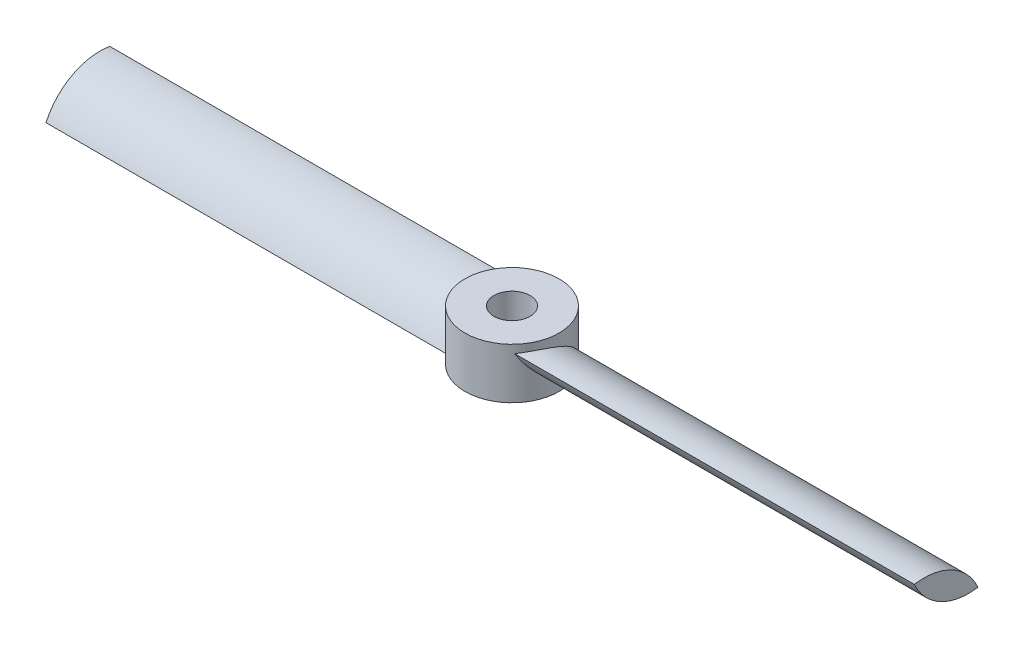
ISO-10303-21;
HEADER;
FILE_DESCRIPTION(('STEP AP214'),'2;1');
FILE_NAME('part.step','',(''),(''),'','','');
FILE_SCHEMA(('AUTOMOTIVE_DESIGN { 1 0 10303 214 1 1 1 1 }'));
ENDSEC;
DATA;
#1=APPLICATION_CONTEXT('core data for automotive mechanical design processes');
#2=APPLICATION_PROTOCOL_DEFINITION('international standard','automotive_design',2000,#1);
#3=PRODUCT_CONTEXT('',#1,'mechanical');
#4=PRODUCT('Part','Part','',(#3));
#5=PRODUCT_RELATED_PRODUCT_CATEGORY('part','',(#4));
#6=PRODUCT_DEFINITION_FORMATION('','',#4);
#7=PRODUCT_DEFINITION_CONTEXT('part definition',#1,'design');
#8=PRODUCT_DEFINITION('design','',#6,#7);
#9=PRODUCT_DEFINITION_SHAPE('','',#8);
#10=(LENGTH_UNIT() NAMED_UNIT(*) SI_UNIT(.MILLI.,.METRE.));
#11=(NAMED_UNIT(*) PLANE_ANGLE_UNIT() SI_UNIT($,.RADIAN.));
#12=(NAMED_UNIT(*) SI_UNIT($,.STERADIAN.) SOLID_ANGLE_UNIT());
#13=UNCERTAINTY_MEASURE_WITH_UNIT(LENGTH_MEASURE(1.E-05),#10,'distance_accuracy_value','');
#14=(GEOMETRIC_REPRESENTATION_CONTEXT(3) GLOBAL_UNCERTAINTY_ASSIGNED_CONTEXT((#13)) GLOBAL_UNIT_ASSIGNED_CONTEXT((#10,
#11,#12)) REPRESENTATION_CONTEXT('',''));
#15=CARTESIAN_POINT('',(0.,0.,0.));
#16=DIRECTION('',(0.,0.,1.));
#17=DIRECTION('',(1.,0.,0.));
#18=AXIS2_PLACEMENT_3D('',#15,#16,#17);
#19=CARTESIAN_POINT('',(0.,7.,0.));
#20=DIRECTION('',(0.,1.,0.));
#21=DIRECTION('',(0.,0.,1.));
#22=AXIS2_PLACEMENT_3D('',#19,#20,#21);
#23=PLANE('',#22);
#24=CARTESIAN_POINT('',(0.,7.,0.));
#25=DIRECTION('',(0.,1.,0.));
#26=DIRECTION('',(0.,0.,1.));
#27=AXIS2_PLACEMENT_3D('',#24,#25,#26);
#28=CIRCLE('',#27,6.5);
#29=CARTESIAN_POINT('',(0.,7.,6.5));
#30=VERTEX_POINT('',#29);
#31=EDGE_CURVE('E139',#30,#30,#28,.T.);
#32=ORIENTED_EDGE('',*,*,#31,.T.);
#33=EDGE_LOOP('',(#32));
#34=FACE_BOUND('',#33,.T.);
#35=CARTESIAN_POINT('',(0.,7.,0.));
#36=DIRECTION('',(0.,1.,0.));
#37=DIRECTION('',(0.,0.,1.));
#38=AXIS2_PLACEMENT_3D('',#35,#36,#37);
#39=CIRCLE('',#38,2.5);
#40=CARTESIAN_POINT('',(0.,7.,2.5));
#41=VERTEX_POINT('',#40);
#42=EDGE_CURVE('E131',#41,#41,#39,.T.);
#43=ORIENTED_EDGE('',*,*,#42,.F.);
#44=EDGE_LOOP('',(#43));
#45=FACE_BOUND('',#44,.T.);
#46=ADVANCED_FACE('F47',(#34,#45),#23,.T.);
#47=CARTESIAN_POINT('',(0.,0.,0.));
#48=DIRECTION('',(0.,1.,0.));
#49=DIRECTION('',(0.,0.,1.));
#50=AXIS2_PLACEMENT_3D('',#47,#48,#49);
#51=PLANE('',#50);
#52=CARTESIAN_POINT('',(0.,0.,0.));
#53=DIRECTION('',(0.,1.,0.));
#54=DIRECTION('',(0.,0.,1.));
#55=AXIS2_PLACEMENT_3D('',#52,#53,#54);
#56=CIRCLE('',#55,6.5);
#57=CARTESIAN_POINT('',(0.,0.,6.5));
#58=VERTEX_POINT('',#57);
#59=EDGE_CURVE('E135',#58,#58,#56,.T.);
#60=ORIENTED_EDGE('',*,*,#59,.F.);
#61=EDGE_LOOP('',(#60));
#62=FACE_BOUND('',#61,.T.);
#63=CARTESIAN_POINT('',(0.,0.,0.));
#64=DIRECTION('',(0.,1.,0.));
#65=DIRECTION('',(0.,0.,1.));
#66=AXIS2_PLACEMENT_3D('',#63,#64,#65);
#67=CIRCLE('',#66,2.5);
#68=CARTESIAN_POINT('',(0.,0.,2.5));
#69=VERTEX_POINT('',#68);
#70=EDGE_CURVE('E130',#69,#69,#67,.T.);
#71=ORIENTED_EDGE('',*,*,#70,.T.);
#72=EDGE_LOOP('',(#71));
#73=FACE_BOUND('',#72,.T.);
#74=ADVANCED_FACE('F175',(#62,#73),#51,.F.);
#75=CARTESIAN_POINT('',(0.,7.,0.));
#76=DIRECTION('',(0.,-1.,0.));
#77=DIRECTION('',(0.,0.,-1.));
#78=AXIS2_PLACEMENT_3D('',#75,#76,#77);
#79=CYLINDRICAL_SURFACE('',#78,6.5);
#80=CARTESIAN_POINT('',(-4.7821821436501,5.87049911517509,-4.40235549961087));
#81=CARTESIAN_POINT('',(-4.83064414254382,5.75307849011286,-4.34971721674044));
#82=CARTESIAN_POINT('',(-4.87990007531833,5.63718924817442,-4.29446194755524));
#83=CARTESIAN_POINT('',(-4.97934252504515,5.40844816549399,-4.1787508646116));
#84=CARTESIAN_POINT('',(-5.02952902312219,5.29559626325717,-4.11829515624686));
#85=CARTESIAN_POINT('',(-5.18064033294913,4.96124427834919,-3.92900023104887));
#86=CARTESIAN_POINT('',(-5.28197964130929,4.74427172089679,-3.79237859337446));
#87=CARTESIAN_POINT('',(-5.48201816255056,4.32081778718442,-3.49709020025005));
#88=CARTESIAN_POINT('',(-5.58068011473167,4.11446532399425,-3.33821366554871));
#89=CARTESIAN_POINT('',(-5.76977191253925,3.71578718343125,-2.99954925464827));
#90=CARTESIAN_POINT('',(-5.8602087829891,3.52344956480868,-2.81977952748504));
#91=CARTESIAN_POINT('',(-6.00082777656387,3.21498198799895,-2.50191697257492));
#92=CARTESIAN_POINT('',(-6.05448191443204,3.09455355994512,-2.36950239094969));
#93=CARTESIAN_POINT('',(-6.15469441903155,2.8614116783889,-2.09547389795706));
#94=CARTESIAN_POINT('',(-6.2012531335545,2.74869784689459,-1.95386043797053));
#95=CARTESIAN_POINT('',(-6.28565115537736,2.53222289336979,-1.66238370282706));
#96=CARTESIAN_POINT('',(-6.32352442507828,2.42842792820188,-1.51255550140705));
#97=CARTESIAN_POINT('',(-6.38931550033209,2.23017901748577,-1.20474113971181));
#98=CARTESIAN_POINT('',(-6.41723496009312,2.13572352171302,-1.04675633996961));
#99=CARTESIAN_POINT('',(-6.45807981110886,1.97148438860737,-0.749617808270409));
#100=CARTESIAN_POINT('',(-6.47269726112326,1.9001786123533,-0.611536570397726));
#101=CARTESIAN_POINT('',(-6.49308830236873,1.76531312347445,-0.331015669890624));
#102=CARTESIAN_POINT('',(-6.49886353682219,1.70175197362269,-0.188576822086766));
#103=CARTESIAN_POINT('',(-6.5008332970216,1.58282493814278,0.0997949089279416));
#104=CARTESIAN_POINT('',(-6.49702583145035,1.52746075840377,0.245728512119164));
#105=CARTESIAN_POINT('',(-6.47920924664528,1.42531356801808,0.539970665864429));
#106=CARTESIAN_POINT('',(-6.46520004465342,1.37853062698755,0.688279235675013));
#107=CARTESIAN_POINT('',(-6.42646291900958,1.2936248860239,0.98654203323697));
#108=CARTESIAN_POINT('',(-6.40169816750957,1.25553253309935,1.13650017414418));
#109=CARTESIAN_POINT('',(-6.34118974554054,1.1882546389773,1.43620416867612));
#110=CARTESIAN_POINT('',(-6.30544594839662,1.15906920055443,1.58595001983144));
#111=CARTESIAN_POINT('',(-6.22293221814679,1.10942888764528,1.88388290383165));
#112=CARTESIAN_POINT('',(-6.17615939530979,1.08897630522161,2.03206951749061));
#113=CARTESIAN_POINT('',(-6.07176373348164,1.05643172809972,2.32549620563955));
#114=CARTESIAN_POINT('',(-6.01414150407575,1.04433926385776,2.47073644516701));
#115=CARTESIAN_POINT('',(-5.89217105962823,1.02842920447622,2.74844052835948));
#116=CARTESIAN_POINT('',(-5.82843389016116,1.02415862684524,2.88114807508317));
#117=CARTESIAN_POINT('',(-5.69204358803965,1.02188505103255,3.14202373699236));
#118=CARTESIAN_POINT('',(-5.61938651443232,1.02388483283838,3.2701898132265));
#119=CARTESIAN_POINT('',(-5.46574838862474,1.03344831091795,3.52096503731605));
#120=CARTESIAN_POINT('',(-5.38477843115619,1.04100467210471,3.64358128503876));
#121=CARTESIAN_POINT('',(-5.21492630139397,1.06090737931176,3.8827896587537));
#122=CARTESIAN_POINT('',(-5.12604478774283,1.07325332688252,3.99938228494179));
#123=CARTESIAN_POINT('',(-4.99295337664244,1.09386181536266,4.16227380811089));
#124=CARTESIAN_POINT('',(-4.95171979968998,1.10051822811231,4.21124271502949));
#125=CARTESIAN_POINT('',(-4.86793984185861,1.11451360770791,4.30781148946805));
#126=CARTESIAN_POINT('',(-4.82539557012069,1.12185151269691,4.35541334039849));
#127=CARTESIAN_POINT('',(-4.7821821436501,1.12950088482491,4.40235549961088));
#128=B_SPLINE_CURVE_WITH_KNOTS('',3,(#80,#81,#82,#83,#84,#85,#86,#87,#88,#89,#90,#91,#92,#93,
#94,#95,#96,#97,#98,#99,#100,#101,#102,#103,#104,#105,#106,#107,#108,#109,#110,#111,#112,#113,
#114,#115,#116,#117,#118,#119,#120,#121,#122,#123,#124,#125,#126,#127),.UNSPECIFIED.,.F.,.F.,(4,
2,2,2,2,2,2,2,2,2,2,2,2,2,2,2,2,2,2,2,2,2,2,4),(0.,0.412424395206687,0.82484043406315,
1.65081032526283,2.48516794300089,3.31880613151439,3.87892439803388,4.43901520077476,
4.99687706559019,5.55464617694931,6.02245501526971,6.49017690622934,6.95799599939028,
7.42581888761249,7.89525642556378,8.36469938003175,8.83426547087328,9.30380518652116,
9.74517092170496,10.186732365718,10.6277119606797,11.068654878059,11.2617154359852,
11.4544800709796),.UNSPECIFIED.);
#129=CARTESIAN_POINT('',(-4.7821821436501,5.87049911517509,-4.40235549961087));
#130=VERTEX_POINT('',#129);
#131=CARTESIAN_POINT('',(-4.7821821436501,1.12950088482491,4.40235549961088));
#132=VERTEX_POINT('',#131);
#133=EDGE_CURVE('E62',#130,#132,#128,.T.);
#134=ORIENTED_EDGE('',*,*,#133,.F.);
#135=CARTESIAN_POINT('',(-4.7821821436501,5.87049911517509,-4.40235549961088));
#136=CARTESIAN_POINT('',(-4.88766320937093,5.88917689213438,-4.28779478186393));
#137=CARTESIAN_POINT('',(-4.98918102694404,5.90599145402247,-4.1692347784361));
#138=CARTESIAN_POINT('',(-5.18373646436622,5.93492352011488,-3.92469811394374));
#139=CARTESIAN_POINT('',(-5.27676895914507,5.94703819980915,-3.79871704522361));
#140=CARTESIAN_POINT('',(-5.45390508052464,5.96559953020935,-3.53971840560347));
#141=CARTESIAN_POINT('',(-5.53798453135131,5.97203116016814,-3.40668316670556));
#142=CARTESIAN_POINT('',(-5.69631529261127,5.97825307352717,-3.13476219869654));
#143=CARTESIAN_POINT('',(-5.77056859359833,5.97804470411424,-2.99587766205773));
#144=CARTESIAN_POINT('',(-5.90902452010194,5.97015178852389,-2.7126339773875));
#145=CARTESIAN_POINT('',(-5.97318239980489,5.96243499029153,-2.5682537944861));
#146=CARTESIAN_POINT('',(-6.09061712125845,5.93878951745358,-2.27578802159962));
#147=CARTESIAN_POINT('',(-6.143894564103,5.92286129666264,-2.12770263681749));
#148=CARTESIAN_POINT('',(-6.23919524526895,5.88232936195132,-1.82945377606943));
#149=CARTESIAN_POINT('',(-6.2812413370792,5.85774350469477,-1.67929518404446));
#150=CARTESIAN_POINT('',(-6.35414107008765,5.79959817224028,-1.37800941725758));
#151=CARTESIAN_POINT('',(-6.38499543844963,5.76603928029667,-1.22688230607313));
#152=CARTESIAN_POINT('',(-6.43408462201875,5.69224109164672,-0.934431088851243));
#153=CARTESIAN_POINT('',(-6.45298339903484,5.6525451699426,-0.793080285373248));
#154=CARTESIAN_POINT('',(-6.48135958439274,5.56528877725754,-0.511822618964511));
#155=CARTESIAN_POINT('',(-6.49083393072099,5.51772575609254,-0.37191623993084));
#156=CARTESIAN_POINT('',(-6.50079430575211,5.41496777714514,-0.0945553993063757));
#157=CARTESIAN_POINT('',(-6.50127670984996,5.35976975076334,0.0428980512188811));
#158=CARTESIAN_POINT('',(-6.49381060852867,5.24208690036674,0.314461143915668));
#159=CARTESIAN_POINT('',(-6.48585889341083,5.17959931028395,0.448569493185438));
#160=CARTESIAN_POINT('',(-6.46174288433414,5.04537183343341,0.71746273944143));
#161=CARTESIAN_POINT('',(-6.44529056218441,4.97337818717153,0.852095019370883));
#162=CARTESIAN_POINT('',(-6.40482220603737,4.82253172550726,1.11630581914759));
#163=CARTESIAN_POINT('',(-6.38080324747632,4.74367626650476,1.24588236311385));
#164=CARTESIAN_POINT('',(-6.29860688419894,4.49756347741591,1.62627681221982));
#165=CARTESIAN_POINT('',(-6.23028134221334,4.32071652591468,1.86884552350102));
#166=CARTESIAN_POINT('',(-6.0921229865514,3.99071984324681,2.27382257665893));
#167=CARTESIAN_POINT('',(-6.02658747160085,3.84206916771191,2.44149744698916));
#168=CARTESIAN_POINT('',(-5.88646051027415,3.53368082112882,2.76227885246882));
#169=CARTESIAN_POINT('',(-5.81186812654432,3.37394200323139,2.91538387676101));
#170=CARTESIAN_POINT('',(-5.65617457478009,3.04423666969009,3.20703367607814));
#171=CARTESIAN_POINT('',(-5.5750638463006,2.87425522604331,3.34555634963119));
#172=CARTESIAN_POINT('',(-5.40909081937207,2.52506245031342,3.60774116249649));
#173=CARTESIAN_POINT('',(-5.32423002717874,2.34585481934524,3.73140919545121));
#174=CARTESIAN_POINT('',(-5.16194158894226,1.9968586946429,3.95236702600692));
#175=CARTESIAN_POINT('',(-5.0846145929603,1.82790748868391,4.05105713321269));
#176=CARTESIAN_POINT('',(-4.93165976988153,1.4836157561563,4.23593553183121));
#177=CARTESIAN_POINT('',(-4.85602617742722,1.30830499222131,4.32217451101261));
#178=CARTESIAN_POINT('',(-4.7821821436501,1.12950088482492,4.40235549961087));
#179=B_SPLINE_CURVE_WITH_KNOTS('',3,(#135,#136,#137,#138,#139,#140,#141,#142,#143,#144,#145,
#146,#147,#148,#149,#150,#151,#152,#153,#154,#155,#156,#157,#158,#159,#160,#161,#162,#163,#164,
#165,#166,#167,#168,#169,#170,#171,#172,#173,#174,#175,#176,#177,#178),.UNSPECIFIED.,.F.,.F.,(4,
2,2,2,2,2,2,2,2,2,2,2,2,2,2,2,2,2,2,2,2,4),(0.,0.470464893316255,0.941212087728027,
1.41319981398858,1.88509177945657,2.35901972085607,2.83292147283703,3.30585145706237,
3.77875070793549,4.22232193884454,4.66603723977526,5.10993139616443,5.553994542087,
6.01419983299027,6.47458321549889,7.39506275987095,8.09462715183295,8.79426400803377,
9.4949464349293,10.1953499383263,10.8260555117164,11.4541163880461),.UNSPECIFIED.);
#180=EDGE_CURVE('E11',#130,#132,#179,.T.);
#181=ORIENTED_EDGE('',*,*,#180,.T.);
#182=EDGE_LOOP('',(#134,#181));
#183=FACE_BOUND('',#182,.T.);
#184=CARTESIAN_POINT('',(4.7821821436501,5.87049911517509,4.40235549961087));
#185=CARTESIAN_POINT('',(4.83064414254382,5.75307849011286,4.34971721674044));
#186=CARTESIAN_POINT('',(4.87990007531833,5.63718924817442,4.29446194755524));
#187=CARTESIAN_POINT('',(4.97934252504515,5.40844816549399,4.1787508646116));
#188=CARTESIAN_POINT('',(5.02952902312219,5.29559626325717,4.11829515624686));
#189=CARTESIAN_POINT('',(5.18064033294913,4.96124427834919,3.92900023104887));
#190=CARTESIAN_POINT('',(5.28197964130929,4.74427172089679,3.79237859337446));
#191=CARTESIAN_POINT('',(5.48201816255056,4.32081778718442,3.49709020025005));
#192=CARTESIAN_POINT('',(5.58068011473167,4.11446532399425,3.33821366554871));
#193=CARTESIAN_POINT('',(5.76977191253925,3.71578718343125,2.99954925464827));
#194=CARTESIAN_POINT('',(5.8602087829891,3.52344956480868,2.81977952748504));
#195=CARTESIAN_POINT('',(6.00082777656387,3.21498198799895,2.50191697257492));
#196=CARTESIAN_POINT('',(6.05448191443204,3.09455355994512,2.36950239094969));
#197=CARTESIAN_POINT('',(6.15469441903155,2.8614116783889,2.09547389795706));
#198=CARTESIAN_POINT('',(6.2012531335545,2.74869784689459,1.95386043797053));
#199=CARTESIAN_POINT('',(6.28565115537736,2.53222289336979,1.66238370282706));
#200=CARTESIAN_POINT('',(6.32352442507828,2.42842792820188,1.51255550140705));
#201=CARTESIAN_POINT('',(6.38931550033209,2.23017901748577,1.20474113971181));
#202=CARTESIAN_POINT('',(6.41723496009312,2.13572352171302,1.04675633996961));
#203=CARTESIAN_POINT('',(6.45807981110886,1.97148438860737,0.749617808270409));
#204=CARTESIAN_POINT('',(6.47269726112326,1.9001786123533,0.611536570397726));
#205=CARTESIAN_POINT('',(6.49308830236873,1.76531312347445,0.331015669890624));
#206=CARTESIAN_POINT('',(6.49886353682219,1.70175197362269,0.188576822086766));
#207=CARTESIAN_POINT('',(6.5008332970216,1.58282493814278,-0.0997949089279416));
#208=CARTESIAN_POINT('',(6.49702583145035,1.52746075840377,-0.245728512119164));
#209=CARTESIAN_POINT('',(6.47920924664528,1.42531356801808,-0.539970665864429));
#210=CARTESIAN_POINT('',(6.46520004465342,1.37853062698755,-0.688279235675013));
#211=CARTESIAN_POINT('',(6.42646291900958,1.2936248860239,-0.98654203323697));
#212=CARTESIAN_POINT('',(6.40169816750957,1.25553253309935,-1.13650017414418));
#213=CARTESIAN_POINT('',(6.34118974554054,1.1882546389773,-1.43620416867612));
#214=CARTESIAN_POINT('',(6.30544594839662,1.15906920055443,-1.58595001983144));
#215=CARTESIAN_POINT('',(6.22293221814679,1.10942888764528,-1.88388290383165));
#216=CARTESIAN_POINT('',(6.17615939530979,1.08897630522161,-2.03206951749061));
#217=CARTESIAN_POINT('',(6.07176373348164,1.05643172809972,-2.32549620563955));
#218=CARTESIAN_POINT('',(6.01414150407575,1.04433926385776,-2.47073644516701));
#219=CARTESIAN_POINT('',(5.89217105962823,1.02842920447622,-2.74844052835948));
#220=CARTESIAN_POINT('',(5.82843389016116,1.02415862684524,-2.88114807508317));
#221=CARTESIAN_POINT('',(5.69204358803965,1.02188505103255,-3.14202373699236));
#222=CARTESIAN_POINT('',(5.61938651443232,1.02388483283838,-3.2701898132265));
#223=CARTESIAN_POINT('',(5.46574838862474,1.03344831091795,-3.52096503731605));
#224=CARTESIAN_POINT('',(5.38477843115619,1.04100467210471,-3.64358128503876));
#225=CARTESIAN_POINT('',(5.21492630139397,1.06090737931176,-3.8827896587537));
#226=CARTESIAN_POINT('',(5.12604478774283,1.07325332688252,-3.99938228494179));
#227=CARTESIAN_POINT('',(4.99295337664244,1.09386181536266,-4.16227380811089));
#228=CARTESIAN_POINT('',(4.95171979968998,1.10051822811231,-4.21124271502949));
#229=CARTESIAN_POINT('',(4.86793984185861,1.11451360770791,-4.30781148946805));
#230=CARTESIAN_POINT('',(4.82539557012069,1.12185151269691,-4.35541334039849));
#231=CARTESIAN_POINT('',(4.7821821436501,1.12950088482491,-4.40235549961088));
#232=B_SPLINE_CURVE_WITH_KNOTS('',3,(#184,#185,#186,#187,#188,#189,#190,#191,#192,#193,#194,
#195,#196,#197,#198,#199,#200,#201,#202,#203,#204,#205,#206,#207,#208,#209,#210,#211,#212,#213,
#214,#215,#216,#217,#218,#219,#220,#221,#222,#223,#224,#225,#226,#227,#228,#229,#230,#231),
.UNSPECIFIED.,.F.,.F.,(4,2,2,2,2,2,2,2,2,2,2,2,2,2,2,2,2,2,2,2,2,2,2,4),(0.,0.412424395206687,
0.82484043406315,1.65081032526283,2.48516794300089,3.31880613151439,3.87892439803388,
4.43901520077476,4.99687706559019,5.55464617694931,6.02245501526971,6.49017690622934,
6.95799599939028,7.42581888761249,7.89525642556378,8.36469938003175,8.83426547087328,
9.30380518652116,9.74517092170496,10.186732365718,10.6277119606797,11.068654878059,
11.2617154359852,11.4544800709796),.UNSPECIFIED.);
#233=CARTESIAN_POINT('',(4.7821821436501,5.87049911517509,4.40235549961087));
#234=VERTEX_POINT('',#233);
#235=CARTESIAN_POINT('',(4.7821821436501,1.12950088482491,-4.40235549961088));
#236=VERTEX_POINT('',#235);
#237=EDGE_CURVE('E73',#234,#236,#232,.T.);
#238=ORIENTED_EDGE('',*,*,#237,.F.);
#239=CARTESIAN_POINT('',(4.7821821436501,5.87049911517509,4.40235549961088));
#240=CARTESIAN_POINT('',(4.88766320937093,5.88917689213438,4.28779478186393));
#241=CARTESIAN_POINT('',(4.98918102694404,5.90599145402247,4.1692347784361));
#242=CARTESIAN_POINT('',(5.18373646436622,5.93492352011488,3.92469811394374));
#243=CARTESIAN_POINT('',(5.27676895914507,5.94703819980915,3.79871704522361));
#244=CARTESIAN_POINT('',(5.45390508052464,5.96559953020935,3.53971840560347));
#245=CARTESIAN_POINT('',(5.53798453135131,5.97203116016814,3.40668316670556));
#246=CARTESIAN_POINT('',(5.69631529261127,5.97825307352717,3.13476219869654));
#247=CARTESIAN_POINT('',(5.77056859359833,5.97804470411424,2.99587766205773));
#248=CARTESIAN_POINT('',(5.90902452010194,5.97015178852389,2.7126339773875));
#249=CARTESIAN_POINT('',(5.97318239980489,5.96243499029153,2.5682537944861));
#250=CARTESIAN_POINT('',(6.09061712125845,5.93878951745358,2.27578802159962));
#251=CARTESIAN_POINT('',(6.143894564103,5.92286129666264,2.12770263681749));
#252=CARTESIAN_POINT('',(6.23919524526895,5.88232936195132,1.82945377606943));
#253=CARTESIAN_POINT('',(6.2812413370792,5.85774350469477,1.67929518404446));
#254=CARTESIAN_POINT('',(6.35414107008765,5.79959817224028,1.37800941725758));
#255=CARTESIAN_POINT('',(6.38499543844963,5.76603928029667,1.22688230607313));
#256=CARTESIAN_POINT('',(6.43408462201875,5.69224109164672,0.934431088851243));
#257=CARTESIAN_POINT('',(6.45298339903484,5.6525451699426,0.793080285373248));
#258=CARTESIAN_POINT('',(6.48135958439274,5.56528877725754,0.511822618964511));
#259=CARTESIAN_POINT('',(6.49083393072099,5.51772575609254,0.37191623993084));
#260=CARTESIAN_POINT('',(6.50079430575211,5.41496777714514,0.0945553993063757));
#261=CARTESIAN_POINT('',(6.50127670984996,5.35976975076334,-0.0428980512188811));
#262=CARTESIAN_POINT('',(6.49381060852867,5.24208690036674,-0.314461143915668));
#263=CARTESIAN_POINT('',(6.48585889341083,5.17959931028395,-0.448569493185438));
#264=CARTESIAN_POINT('',(6.46174288433414,5.04537183343341,-0.71746273944143));
#265=CARTESIAN_POINT('',(6.44529056218441,4.97337818717153,-0.852095019370883));
#266=CARTESIAN_POINT('',(6.40482220603737,4.82253172550726,-1.11630581914759));
#267=CARTESIAN_POINT('',(6.38080324747632,4.74367626650476,-1.24588236311385));
#268=CARTESIAN_POINT('',(6.29860688419894,4.49756347741591,-1.62627681221982));
#269=CARTESIAN_POINT('',(6.23028134221334,4.32071652591468,-1.86884552350102));
#270=CARTESIAN_POINT('',(6.0921229865514,3.99071984324681,-2.27382257665893));
#271=CARTESIAN_POINT('',(6.02658747160085,3.84206916771191,-2.44149744698916));
#272=CARTESIAN_POINT('',(5.88646051027415,3.53368082112882,-2.76227885246882));
#273=CARTESIAN_POINT('',(5.81186812654432,3.37394200323139,-2.91538387676101));
#274=CARTESIAN_POINT('',(5.65617457478009,3.04423666969009,-3.20703367607814));
#275=CARTESIAN_POINT('',(5.5750638463006,2.87425522604331,-3.34555634963119));
#276=CARTESIAN_POINT('',(5.40909081937207,2.52506245031342,-3.60774116249649));
#277=CARTESIAN_POINT('',(5.32423002717874,2.34585481934524,-3.73140919545121));
#278=CARTESIAN_POINT('',(5.16194158894226,1.9968586946429,-3.95236702600692));
#279=CARTESIAN_POINT('',(5.0846145929603,1.82790748868391,-4.05105713321269));
#280=CARTESIAN_POINT('',(4.93165976988153,1.4836157561563,-4.23593553183121));
#281=CARTESIAN_POINT('',(4.85602617742722,1.30830499222131,-4.32217451101261));
#282=CARTESIAN_POINT('',(4.7821821436501,1.12950088482492,-4.40235549961087));
#283=B_SPLINE_CURVE_WITH_KNOTS('',3,(#239,#240,#241,#242,#243,#244,#245,#246,#247,#248,#249,
#250,#251,#252,#253,#254,#255,#256,#257,#258,#259,#260,#261,#262,#263,#264,#265,#266,#267,#268,
#269,#270,#271,#272,#273,#274,#275,#276,#277,#278,#279,#280,#281,#282),.UNSPECIFIED.,.F.,.F.,(4,
2,2,2,2,2,2,2,2,2,2,2,2,2,2,2,2,2,2,2,2,4),(0.,0.470464893316255,0.941212087728027,
1.41319981398858,1.88509177945657,2.35901972085607,2.83292147283703,3.30585145706237,
3.77875070793549,4.22232193884454,4.66603723977526,5.10993139616443,5.553994542087,
6.01419983299027,6.47458321549889,7.39506275987095,8.09462715183295,8.79426400803377,
9.4949464349293,10.1953499383263,10.8260555117164,11.4541163880461),.UNSPECIFIED.);
#284=EDGE_CURVE('E153',#234,#236,#283,.T.);
#285=ORIENTED_EDGE('',*,*,#284,.T.);
#286=EDGE_LOOP('',(#238,#285));
#287=FACE_BOUND('',#286,.T.);
#288=ORIENTED_EDGE('',*,*,#31,.F.);
#289=EDGE_LOOP('',(#288));
#290=FACE_BOUND('',#289,.T.);
#291=ORIENTED_EDGE('',*,*,#59,.T.);
#292=EDGE_LOOP('',(#291));
#293=FACE_BOUND('',#292,.T.);
#294=ADVANCED_FACE('F49',(#183,#287,#290,#293),#79,.T.);
#295=CARTESIAN_POINT('',(0.,7.,0.));
#296=DIRECTION('',(0.,-1.,0.));
#297=DIRECTION('',(0.,0.,-1.));
#298=AXIS2_PLACEMENT_3D('',#295,#296,#297);
#299=CYLINDRICAL_SURFACE('',#298,2.5);
#300=ORIENTED_EDGE('',*,*,#42,.T.);
#301=EDGE_LOOP('',(#300));
#302=FACE_BOUND('',#301,.T.);
#303=ORIENTED_EDGE('',*,*,#70,.F.);
#304=EDGE_LOOP('',(#303));
#305=FACE_BOUND('',#304,.T.);
#306=ADVANCED_FACE('F169',(#302,#305),#299,.F.);
#307=CARTESIAN_POINT('',(60.,-2.22565177037629,3.08304326097185));
#308=DIRECTION('',(-1.,0.,0.));
#309=DIRECTION('',(0.,0.,1.));
#310=AXIS2_PLACEMENT_3D('',#307,#308,#309);
#311=CYLINDRICAL_SURFACE('',#310,8.20294117647061);
#312=ORIENTED_EDGE('',*,*,#284,.F.);
#313=DIRECTION('',(-1.,0.,0.));
#314=VECTOR('',#313,1.);
#315=CARTESIAN_POINT('',(60.,5.87049911517509,4.40235549961088));
#316=LINE('',#315,#314);
#317=CARTESIAN_POINT('',(60.,5.87049911517509,4.40235549961088));
#318=VERTEX_POINT('',#317);
#319=EDGE_CURVE('E126',#318,#234,#316,.T.);
#320=ORIENTED_EDGE('',*,*,#319,.F.);
#321=CARTESIAN_POINT('',(60.,-2.22565177037629,3.08304326097185));
#322=DIRECTION('',(1.,0.,0.));
#323=DIRECTION('',(0.,0.,-1.));
#324=AXIS2_PLACEMENT_3D('',#321,#322,#323);
#325=CIRCLE('',#324,8.20294117647061);
#326=CARTESIAN_POINT('',(60.,1.12950088482491,-4.40235549961088));
#327=VERTEX_POINT('',#326);
#328=EDGE_CURVE('E101',#318,#327,#325,.F.);
#329=ORIENTED_EDGE('',*,*,#328,.T.);
#330=DIRECTION('',(-1.,0.,0.));
#331=VECTOR('',#330,1.);
#332=CARTESIAN_POINT('',(60.,1.12950088482491,-4.40235549961088));
#333=LINE('',#332,#331);
#334=EDGE_CURVE('E122',#327,#236,#333,.T.);
#335=ORIENTED_EDGE('',*,*,#334,.T.);
#336=EDGE_LOOP('',(#312,#320,#329,#335));
#337=FACE_BOUND('',#336,.T.);
#338=ADVANCED_FACE('F164',(#337),#311,.T.);
#339=CARTESIAN_POINT('',(60.,9.2256517703763,-3.08304326097185));
#340=DIRECTION('',(-1.,0.,0.));
#341=DIRECTION('',(0.,0.,1.));
#342=AXIS2_PLACEMENT_3D('',#339,#340,#341);
#343=CYLINDRICAL_SURFACE('',#342,8.20294117647062);
#344=ORIENTED_EDGE('',*,*,#319,.T.);
#345=ORIENTED_EDGE('',*,*,#237,.T.);
#346=ORIENTED_EDGE('',*,*,#334,.F.);
#347=CARTESIAN_POINT('',(60.,9.2256517703763,-3.08304326097185));
#348=DIRECTION('',(1.,0.,0.));
#349=DIRECTION('',(0.,0.,-1.));
#350=AXIS2_PLACEMENT_3D('',#347,#348,#349);
#351=CIRCLE('',#350,8.20294117647062);
#352=EDGE_CURVE('E119',#318,#327,#351,.T.);
#353=ORIENTED_EDGE('',*,*,#352,.F.);
#354=EDGE_LOOP('',(#344,#345,#346,#353));
#355=FACE_BOUND('',#354,.T.);
#356=ADVANCED_FACE('F159',(#355),#343,.T.);
#357=CARTESIAN_POINT('',(60.,0.,0.));
#358=DIRECTION('',(1.,0.,0.));
#359=DIRECTION('',(0.,0.,-1.));
#360=AXIS2_PLACEMENT_3D('',#357,#358,#359);
#361=PLANE('',#360);
#362=ORIENTED_EDGE('',*,*,#328,.F.);
#363=ORIENTED_EDGE('',*,*,#352,.T.);
#364=EDGE_LOOP('',(#362,#363));
#365=FACE_BOUND('',#364,.T.);
#366=ADVANCED_FACE('F163',(#365),#361,.T.);
#367=CARTESIAN_POINT('',(-60.,-2.22565177037629,-3.08304326097185));
#368=DIRECTION('',(1.,0.,0.));
#369=DIRECTION('',(0.,0.,-1.));
#370=AXIS2_PLACEMENT_3D('',#367,#368,#369);
#371=CYLINDRICAL_SURFACE('',#370,8.20294117647061);
#372=ORIENTED_EDGE('',*,*,#180,.F.);
#373=DIRECTION('',(1.,0.,0.));
#374=VECTOR('',#373,1.);
#375=CARTESIAN_POINT('',(-60.,5.87049911517509,-4.40235549961088));
#376=LINE('',#375,#374);
#377=CARTESIAN_POINT('',(-60.,5.87049911517509,-4.40235549961088));
#378=VERTEX_POINT('',#377);
#379=EDGE_CURVE('E93',#378,#130,#376,.T.);
#380=ORIENTED_EDGE('',*,*,#379,.F.);
#381=CARTESIAN_POINT('',(-60.,-2.22565177037629,-3.08304326097185));
#382=DIRECTION('',(-1.,0.,0.));
#383=DIRECTION('',(0.,0.,1.));
#384=AXIS2_PLACEMENT_3D('',#381,#382,#383);
#385=CIRCLE('',#384,8.20294117647061);
#386=CARTESIAN_POINT('',(-60.,1.12950088482491,4.40235549961088));
#387=VERTEX_POINT('',#386);
#388=EDGE_CURVE('E98',#378,#387,#385,.F.);
#389=ORIENTED_EDGE('',*,*,#388,.T.);
#390=DIRECTION('',(1.,0.,0.));
#391=VECTOR('',#390,1.);
#392=CARTESIAN_POINT('',(-60.,1.12950088482491,4.40235549961088));
#393=LINE('',#392,#391);
#394=EDGE_CURVE('E102',#387,#132,#393,.T.);
#395=ORIENTED_EDGE('',*,*,#394,.T.);
#396=EDGE_LOOP('',(#372,#380,#389,#395));
#397=FACE_BOUND('',#396,.T.);
#398=ADVANCED_FACE('F95',(#397),#371,.T.);
#399=CARTESIAN_POINT('',(-60.,9.2256517703763,3.08304326097185));
#400=DIRECTION('',(1.,0.,0.));
#401=DIRECTION('',(0.,0.,-1.));
#402=AXIS2_PLACEMENT_3D('',#399,#400,#401);
#403=CYLINDRICAL_SURFACE('',#402,8.20294117647062);
#404=ORIENTED_EDGE('',*,*,#379,.T.);
#405=ORIENTED_EDGE('',*,*,#133,.T.);
#406=ORIENTED_EDGE('',*,*,#394,.F.);
#407=CARTESIAN_POINT('',(-60.,9.2256517703763,3.08304326097185));
#408=DIRECTION('',(-1.,0.,0.));
#409=DIRECTION('',(0.,0.,1.));
#410=AXIS2_PLACEMENT_3D('',#407,#408,#409);
#411=CIRCLE('',#410,8.20294117647062);
#412=EDGE_CURVE('E105',#378,#387,#411,.T.);
#413=ORIENTED_EDGE('',*,*,#412,.F.);
#414=EDGE_LOOP('',(#404,#405,#406,#413));
#415=FACE_BOUND('',#414,.T.);
#416=ADVANCED_FACE('F106',(#415),#403,.T.);
#417=CARTESIAN_POINT('',(-60.,0.,0.));
#418=DIRECTION('',(-1.,0.,0.));
#419=DIRECTION('',(0.,0.,1.));
#420=AXIS2_PLACEMENT_3D('',#417,#418,#419);
#421=PLANE('',#420);
#422=ORIENTED_EDGE('',*,*,#388,.F.);
#423=ORIENTED_EDGE('',*,*,#412,.T.);
#424=EDGE_LOOP('',(#422,#423));
#425=FACE_BOUND('',#424,.T.);
#426=ADVANCED_FACE('F110',(#425),#421,.T.);
#427=CLOSED_SHELL('',(#46,#74,#294,#306,#338,#356,#366,#398,#416,#426));
#428=MANIFOLD_SOLID_BREP('B2',#427);
#429=ADVANCED_BREP_SHAPE_REPRESENTATION('',(#18,#428),#14);
#430=SHAPE_DEFINITION_REPRESENTATION(#9,#429);
ENDSEC;
END-ISO-10303-21;
